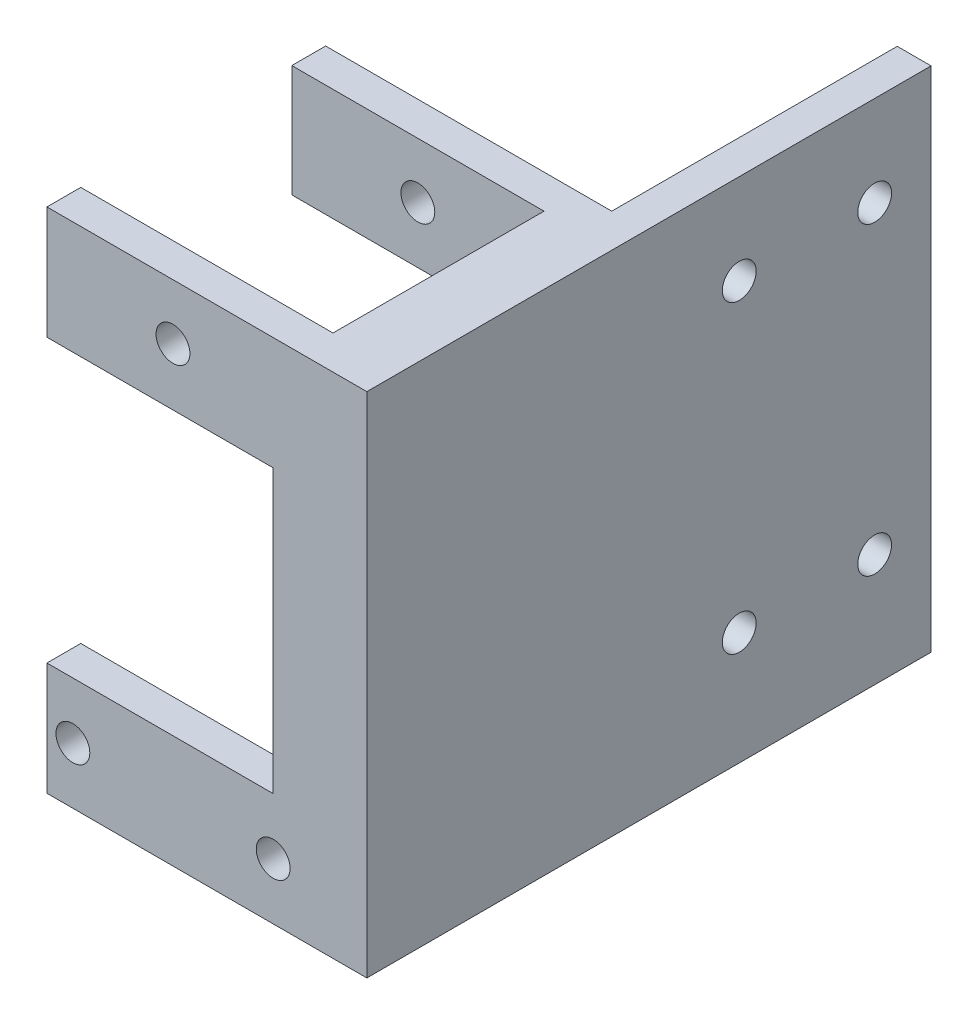
ISO-10303-21;
HEADER;
FILE_DESCRIPTION(('STEP AP214'),'2;1');
FILE_NAME('part.step','',(''),(''),'','','');
FILE_SCHEMA(('AUTOMOTIVE_DESIGN { 1 0 10303 214 1 1 1 1 }'));
ENDSEC;
DATA;
#1=APPLICATION_CONTEXT('core data for automotive mechanical design processes');
#2=APPLICATION_PROTOCOL_DEFINITION('international standard','automotive_design',2000,#1);
#3=PRODUCT_CONTEXT('',#1,'mechanical');
#4=PRODUCT('Part','Part','',(#3));
#5=PRODUCT_RELATED_PRODUCT_CATEGORY('part','',(#4));
#6=PRODUCT_DEFINITION_FORMATION('','',#4);
#7=PRODUCT_DEFINITION_CONTEXT('part definition',#1,'design');
#8=PRODUCT_DEFINITION('design','',#6,#7);
#9=PRODUCT_DEFINITION_SHAPE('','',#8);
#10=(LENGTH_UNIT() NAMED_UNIT(*) SI_UNIT(.MILLI.,.METRE.));
#11=(NAMED_UNIT(*) PLANE_ANGLE_UNIT() SI_UNIT($,.RADIAN.));
#12=(NAMED_UNIT(*) SI_UNIT($,.STERADIAN.) SOLID_ANGLE_UNIT());
#13=UNCERTAINTY_MEASURE_WITH_UNIT(LENGTH_MEASURE(1.E-05),#10,'distance_accuracy_value','');
#14=(GEOMETRIC_REPRESENTATION_CONTEXT(3) GLOBAL_UNCERTAINTY_ASSIGNED_CONTEXT((#13)) GLOBAL_UNIT_ASSIGNED_CONTEXT((#10,
#11,#12)) REPRESENTATION_CONTEXT('',''));
#15=CARTESIAN_POINT('',(0.,0.,0.));
#16=DIRECTION('',(0.,0.,1.));
#17=DIRECTION('',(1.,0.,0.));
#18=AXIS2_PLACEMENT_3D('',#15,#16,#17);
#19=CARTESIAN_POINT('',(0.,-22.5,-3.));
#20=DIRECTION('',(0.,1.,0.));
#21=DIRECTION('',(-1.,0.,0.));
#22=AXIS2_PLACEMENT_3D('',#19,#20,#21);
#23=PLANE('',#22);
#24=DIRECTION('',(0.,0.,1.));
#25=VECTOR('',#24,1.);
#26=CARTESIAN_POINT('',(9.675,-22.5,-21.7));
#27=LINE('',#26,#25);
#28=CARTESIAN_POINT('',(9.675,-22.5,-21.7));
#29=VERTEX_POINT('',#28);
#30=CARTESIAN_POINT('',(9.675,-22.5,-3.));
#31=VERTEX_POINT('',#30);
#32=EDGE_CURVE('E148',#29,#31,#27,.T.);
#33=ORIENTED_EDGE('',*,*,#32,.F.);
#34=DIRECTION('',(1.,0.,0.));
#35=VECTOR('',#34,1.);
#36=CARTESIAN_POINT('',(15.675,-22.5,-21.7));
#37=LINE('',#36,#35);
#38=CARTESIAN_POINT('',(-12.675,-22.5,-21.7));
#39=VERTEX_POINT('',#38);
#40=EDGE_CURVE('E260',#39,#29,#37,.T.);
#41=ORIENTED_EDGE('',*,*,#40,.F.);
#42=DIRECTION('',(0.,0.,1.));
#43=VECTOR('',#42,1.);
#44=CARTESIAN_POINT('',(-12.675,-22.5,-26.7));
#45=LINE('',#44,#43);
#46=CARTESIAN_POINT('',(-12.675,-22.5,-24.7));
#47=VERTEX_POINT('',#46);
#48=EDGE_CURVE('E478',#47,#39,#45,.T.);
#49=ORIENTED_EDGE('',*,*,#48,.F.);
#50=DIRECTION('',(-1.,0.,0.));
#51=VECTOR('',#50,1.);
#52=CARTESIAN_POINT('',(15.675,-22.5,-24.7));
#53=LINE('',#52,#51);
#54=CARTESIAN_POINT('',(12.675,-22.5,-24.7));
#55=VERTEX_POINT('',#54);
#56=EDGE_CURVE('E284',#55,#47,#53,.T.);
#57=ORIENTED_EDGE('',*,*,#56,.F.);
#58=DIRECTION('',(0.,0.,-1.));
#59=VECTOR('',#58,1.);
#60=CARTESIAN_POINT('',(12.675,-22.5,0.));
#61=LINE('',#60,#59);
#62=CARTESIAN_POINT('',(12.675,-22.5,-50.));
#63=VERTEX_POINT('',#62);
#64=EDGE_CURVE('E289',#55,#63,#61,.T.);
#65=ORIENTED_EDGE('',*,*,#64,.T.);
#66=DIRECTION('',(-1.,0.,0.));
#67=VECTOR('',#66,1.);
#68=CARTESIAN_POINT('',(15.675,-22.5,-50.));
#69=LINE('',#68,#67);
#70=CARTESIAN_POINT('',(15.675,-22.5,-50.));
#71=VERTEX_POINT('',#70);
#72=EDGE_CURVE('E329',#71,#63,#69,.T.);
#73=ORIENTED_EDGE('',*,*,#72,.F.);
#74=DIRECTION('',(0.,0.,-1.));
#75=VECTOR('',#74,1.);
#76=CARTESIAN_POINT('',(15.675,-22.5,0.));
#77=LINE('',#76,#75);
#78=CARTESIAN_POINT('',(15.675,-22.5,0.));
#79=VERTEX_POINT('',#78);
#80=EDGE_CURVE('E307',#79,#71,#77,.T.);
#81=ORIENTED_EDGE('',*,*,#80,.F.);
#82=DIRECTION('',(-1.,0.,0.));
#83=VECTOR('',#82,1.);
#84=CARTESIAN_POINT('',(0.,-22.5,0.));
#85=LINE('',#84,#83);
#86=CARTESIAN_POINT('',(-12.675,-22.5,0.));
#87=VERTEX_POINT('',#86);
#88=EDGE_CURVE('E393',#79,#87,#85,.T.);
#89=ORIENTED_EDGE('',*,*,#88,.T.);
#90=DIRECTION('',(0.,0.,1.));
#91=VECTOR('',#90,1.);
#92=CARTESIAN_POINT('',(-12.675,-22.5,-3.));
#93=LINE('',#92,#91);
#94=CARTESIAN_POINT('',(-12.675,-22.5,-3.));
#95=VERTEX_POINT('',#94);
#96=EDGE_CURVE('E407',#95,#87,#93,.T.);
#97=ORIENTED_EDGE('',*,*,#96,.F.);
#98=DIRECTION('',(-1.,0.,0.));
#99=VECTOR('',#98,1.);
#100=CARTESIAN_POINT('',(0.,-22.5,-3.));
#101=LINE('',#100,#99);
#102=EDGE_CURVE('E262',#31,#95,#101,.T.);
#103=ORIENTED_EDGE('',*,*,#102,.F.);
#104=EDGE_LOOP('',(#33,#41,#49,#57,#65,#73,#81,#89,#97,#103));
#105=FACE_BOUND('',#104,.T.);
#106=ADVANCED_FACE('F130',(#105),#23,.F.);
#107=CARTESIAN_POINT('',(0.,22.5,-3.));
#108=DIRECTION('',(0.,1.,0.));
#109=DIRECTION('',(-1.,0.,0.));
#110=AXIS2_PLACEMENT_3D('',#107,#108,#109);
#111=PLANE('',#110);
#112=DIRECTION('',(-1.,0.,0.));
#113=VECTOR('',#112,1.);
#114=CARTESIAN_POINT('',(15.675,22.5,-24.7));
#115=LINE('',#114,#113);
#116=CARTESIAN_POINT('',(12.675,22.5,-24.7));
#117=VERTEX_POINT('',#116);
#118=CARTESIAN_POINT('',(-12.675,22.5,-24.7));
#119=VERTEX_POINT('',#118);
#120=EDGE_CURVE('E296',#117,#119,#115,.T.);
#121=ORIENTED_EDGE('',*,*,#120,.T.);
#122=DIRECTION('',(0.,0.,1.));
#123=VECTOR('',#122,1.);
#124=CARTESIAN_POINT('',(-12.675,22.5,-26.7));
#125=LINE('',#124,#123);
#126=CARTESIAN_POINT('',(-12.675,22.5,-21.7));
#127=VERTEX_POINT('',#126);
#128=EDGE_CURVE('E481',#119,#127,#125,.T.);
#129=ORIENTED_EDGE('',*,*,#128,.T.);
#130=DIRECTION('',(1.,0.,0.));
#131=VECTOR('',#130,1.);
#132=CARTESIAN_POINT('',(15.675,22.5,-21.7));
#133=LINE('',#132,#131);
#134=CARTESIAN_POINT('',(9.675,22.5,-21.7));
#135=VERTEX_POINT('',#134);
#136=EDGE_CURVE('E292',#127,#135,#133,.T.);
#137=ORIENTED_EDGE('',*,*,#136,.T.);
#138=DIRECTION('',(0.,0.,-1.));
#139=VECTOR('',#138,1.);
#140=CARTESIAN_POINT('',(9.675,22.5,-21.7));
#141=LINE('',#140,#139);
#142=CARTESIAN_POINT('',(9.675,22.5,-3.));
#143=VERTEX_POINT('',#142);
#144=EDGE_CURVE('E270',#143,#135,#141,.T.);
#145=ORIENTED_EDGE('',*,*,#144,.F.);
#146=DIRECTION('',(-1.,0.,0.));
#147=VECTOR('',#146,1.);
#148=CARTESIAN_POINT('',(0.,22.5,-3.));
#149=LINE('',#148,#147);
#150=CARTESIAN_POINT('',(-12.675,22.5,-3.));
#151=VERTEX_POINT('',#150);
#152=EDGE_CURVE('E334',#143,#151,#149,.T.);
#153=ORIENTED_EDGE('',*,*,#152,.T.);
#154=DIRECTION('',(0.,0.,1.));
#155=VECTOR('',#154,1.);
#156=CARTESIAN_POINT('',(-12.675,22.5,-3.));
#157=LINE('',#156,#155);
#158=CARTESIAN_POINT('',(-12.675,22.5,0.));
#159=VERTEX_POINT('',#158);
#160=EDGE_CURVE('E370',#151,#159,#157,.T.);
#161=ORIENTED_EDGE('',*,*,#160,.T.);
#162=DIRECTION('',(-1.,0.,0.));
#163=VECTOR('',#162,1.);
#164=CARTESIAN_POINT('',(0.,22.5,0.));
#165=LINE('',#164,#163);
#166=CARTESIAN_POINT('',(15.675,22.5,0.));
#167=VERTEX_POINT('',#166);
#168=EDGE_CURVE('E333',#167,#159,#165,.T.);
#169=ORIENTED_EDGE('',*,*,#168,.F.);
#170=DIRECTION('',(0.,0.,1.));
#171=VECTOR('',#170,1.);
#172=CARTESIAN_POINT('',(15.675,22.5,0.));
#173=LINE('',#172,#171);
#174=CARTESIAN_POINT('',(15.675,22.5,-50.));
#175=VERTEX_POINT('',#174);
#176=EDGE_CURVE('E314',#175,#167,#173,.T.);
#177=ORIENTED_EDGE('',*,*,#176,.F.);
#178=DIRECTION('',(-1.,0.,0.));
#179=VECTOR('',#178,1.);
#180=CARTESIAN_POINT('',(15.675,22.5,-50.));
#181=LINE('',#180,#179);
#182=CARTESIAN_POINT('',(12.675,22.5,-50.));
#183=VERTEX_POINT('',#182);
#184=EDGE_CURVE('E317',#175,#183,#181,.T.);
#185=ORIENTED_EDGE('',*,*,#184,.T.);
#186=DIRECTION('',(0.,0.,1.));
#187=VECTOR('',#186,1.);
#188=CARTESIAN_POINT('',(12.675,22.5,0.));
#189=LINE('',#188,#187);
#190=EDGE_CURVE('E308',#183,#117,#189,.T.);
#191=ORIENTED_EDGE('',*,*,#190,.T.);
#192=EDGE_LOOP('',(#121,#129,#137,#145,#153,#161,#169,#177,#185,#191));
#193=FACE_BOUND('',#192,.T.);
#194=ADVANCED_FACE('F132',(#193),#111,.T.);
#195=CARTESIAN_POINT('',(15.675,-22.5,-21.7));
#196=DIRECTION('',(0.,0.,1.));
#197=DIRECTION('',(1.,0.,0.));
#198=AXIS2_PLACEMENT_3D('',#195,#196,#197);
#199=PLANE('',#198);
#200=DIRECTION('',(0.,-1.,0.));
#201=VECTOR('',#200,1.);
#202=CARTESIAN_POINT('',(9.675,22.5,-21.7));
#203=LINE('',#202,#201);
#204=EDGE_CURVE('E265',#135,#29,#203,.T.);
#205=ORIENTED_EDGE('',*,*,#204,.F.);
#206=ORIENTED_EDGE('',*,*,#136,.F.);
#207=DIRECTION('',(0.,-1.,0.));
#208=VECTOR('',#207,1.);
#209=CARTESIAN_POINT('',(-12.675,0.,-21.7));
#210=LINE('',#209,#208);
#211=CARTESIAN_POINT('',(-12.675,12.5728024085996,-21.7));
#212=VERTEX_POINT('',#211);
#213=EDGE_CURVE('E469',#127,#212,#210,.T.);
#214=ORIENTED_EDGE('',*,*,#213,.T.);
#215=DIRECTION('',(1.,0.,0.));
#216=VECTOR('',#215,1.);
#217=CARTESIAN_POINT('',(0.,12.5728024085996,-21.7));
#218=LINE('',#217,#216);
#219=CARTESIAN_POINT('',(7.37500000000001,12.5728024085996,-21.7));
#220=VERTEX_POINT('',#219);
#221=EDGE_CURVE('E461',#212,#220,#218,.T.);
#222=ORIENTED_EDGE('',*,*,#221,.T.);
#223=DIRECTION('',(0.,1.,0.));
#224=VECTOR('',#223,1.);
#225=CARTESIAN_POINT('',(7.37500000000001,0.,-21.7));
#226=LINE('',#225,#224);
#227=CARTESIAN_POINT('',(7.37500000000001,-12.5,-21.7));
#228=VERTEX_POINT('',#227);
#229=EDGE_CURVE('E455',#228,#220,#226,.T.);
#230=ORIENTED_EDGE('',*,*,#229,.F.);
#231=DIRECTION('',(1.,0.,0.));
#232=VECTOR('',#231,1.);
#233=CARTESIAN_POINT('',(0.,-12.5,-21.7));
#234=LINE('',#233,#232);
#235=CARTESIAN_POINT('',(-12.675,-12.5,-21.7));
#236=VERTEX_POINT('',#235);
#237=EDGE_CURVE('E450',#236,#228,#234,.T.);
#238=ORIENTED_EDGE('',*,*,#237,.F.);
#239=DIRECTION('',(0.,-1.,0.));
#240=VECTOR('',#239,1.);
#241=CARTESIAN_POINT('',(-12.675,0.,-21.7));
#242=LINE('',#241,#240);
#243=EDGE_CURVE('E281',#236,#39,#242,.T.);
#244=ORIENTED_EDGE('',*,*,#243,.T.);
#245=ORIENTED_EDGE('',*,*,#40,.T.);
#246=EDGE_LOOP('',(#205,#206,#214,#222,#230,#238,#244,#245));
#247=FACE_BOUND('',#246,.T.);
#248=CARTESIAN_POINT('',(7.375,-17.5,-21.7));
#249=DIRECTION('',(0.,0.,1.));
#250=DIRECTION('',(1.,0.,0.));
#251=AXIS2_PLACEMENT_3D('',#248,#249,#250);
#252=CIRCLE('',#251,1.5);
#253=CARTESIAN_POINT('',(8.875,-17.5,-21.7));
#254=VERTEX_POINT('',#253);
#255=EDGE_CURVE('E575',#254,#254,#252,.T.);
#256=ORIENTED_EDGE('',*,*,#255,.F.);
#257=EDGE_LOOP('',(#256));
#258=FACE_BOUND('',#257,.T.);
#259=CARTESIAN_POINT('',(-10.375,-17.5,-21.7));
#260=DIRECTION('',(0.,0.,1.));
#261=DIRECTION('',(1.,0.,0.));
#262=AXIS2_PLACEMENT_3D('',#259,#260,#261);
#263=CIRCLE('',#262,1.5);
#264=CARTESIAN_POINT('',(-8.875,-17.5,-21.7));
#265=VERTEX_POINT('',#264);
#266=EDGE_CURVE('E574',#265,#265,#263,.T.);
#267=ORIENTED_EDGE('',*,*,#266,.F.);
#268=EDGE_LOOP('',(#267));
#269=FACE_BOUND('',#268,.T.);
#270=CARTESIAN_POINT('',(-1.50500000000001,17.58,-21.7));
#271=DIRECTION('',(0.,0.,1.));
#272=DIRECTION('',(1.,0.,0.));
#273=AXIS2_PLACEMENT_3D('',#270,#271,#272);
#274=CIRCLE('',#273,1.5);
#275=CARTESIAN_POINT('',(-0.00500000000000327,17.58,-21.7));
#276=VERTEX_POINT('',#275);
#277=EDGE_CURVE('E443',#276,#276,#274,.T.);
#278=ORIENTED_EDGE('',*,*,#277,.F.);
#279=EDGE_LOOP('',(#278));
#280=FACE_BOUND('',#279,.T.);
#281=ADVANCED_FACE('F277',(#247,#258,#269,#280),#199,.T.);
#282=CARTESIAN_POINT('',(15.675,-22.5,-24.7));
#283=DIRECTION('',(0.,0.,-1.));
#284=DIRECTION('',(-1.,0.,0.));
#285=AXIS2_PLACEMENT_3D('',#282,#283,#284);
#286=PLANE('',#285);
#287=CARTESIAN_POINT('',(7.375,-17.5,-24.7));
#288=DIRECTION('',(0.,0.,-1.));
#289=DIRECTION('',(-1.,0.,0.));
#290=AXIS2_PLACEMENT_3D('',#287,#288,#289);
#291=CIRCLE('',#290,1.5);
#292=CARTESIAN_POINT('',(5.875,-17.5,-24.7));
#293=VERTEX_POINT('',#292);
#294=EDGE_CURVE('E134',#293,#293,#291,.T.);
#295=ORIENTED_EDGE('',*,*,#294,.F.);
#296=EDGE_LOOP('',(#295));
#297=FACE_BOUND('',#296,.T.);
#298=CARTESIAN_POINT('',(-10.375,-17.5,-24.7));
#299=DIRECTION('',(0.,0.,-1.));
#300=DIRECTION('',(-1.,0.,0.));
#301=AXIS2_PLACEMENT_3D('',#298,#299,#300);
#302=CIRCLE('',#301,1.5);
#303=CARTESIAN_POINT('',(-11.875,-17.5,-24.7));
#304=VERTEX_POINT('',#303);
#305=EDGE_CURVE('E442',#304,#304,#302,.T.);
#306=ORIENTED_EDGE('',*,*,#305,.F.);
#307=EDGE_LOOP('',(#306));
#308=FACE_BOUND('',#307,.T.);
#309=CARTESIAN_POINT('',(-1.50500000000001,17.58,-24.7));
#310=DIRECTION('',(0.,0.,-1.));
#311=DIRECTION('',(-1.,0.,0.));
#312=AXIS2_PLACEMENT_3D('',#309,#310,#311);
#313=CIRCLE('',#312,1.5);
#314=CARTESIAN_POINT('',(-3.00500000000001,17.58,-24.7));
#315=VERTEX_POINT('',#314);
#316=EDGE_CURVE('E439',#315,#315,#313,.T.);
#317=ORIENTED_EDGE('',*,*,#316,.F.);
#318=EDGE_LOOP('',(#317));
#319=FACE_BOUND('',#318,.T.);
#320=ORIENTED_EDGE('',*,*,#56,.T.);
#321=DIRECTION('',(0.,1.,0.));
#322=VECTOR('',#321,1.);
#323=CARTESIAN_POINT('',(-12.675,-22.5,-24.7));
#324=LINE('',#323,#322);
#325=CARTESIAN_POINT('',(-12.675,-12.5,-24.7));
#326=VERTEX_POINT('',#325);
#327=EDGE_CURVE('E12',#47,#326,#324,.T.);
#328=ORIENTED_EDGE('',*,*,#327,.T.);
#329=DIRECTION('',(-1.,0.,0.));
#330=VECTOR('',#329,1.);
#331=CARTESIAN_POINT('',(15.675,-12.5,-24.7));
#332=LINE('',#331,#330);
#333=CARTESIAN_POINT('',(7.37500000000001,-12.5,-24.7));
#334=VERTEX_POINT('',#333);
#335=EDGE_CURVE('E140',#334,#326,#332,.T.);
#336=ORIENTED_EDGE('',*,*,#335,.F.);
#337=DIRECTION('',(0.,-1.,0.));
#338=VECTOR('',#337,1.);
#339=CARTESIAN_POINT('',(7.37500000000001,-22.5,-24.7));
#340=LINE('',#339,#338);
#341=CARTESIAN_POINT('',(7.37500000000001,12.5728024085996,-24.7));
#342=VERTEX_POINT('',#341);
#343=EDGE_CURVE('E411',#342,#334,#340,.T.);
#344=ORIENTED_EDGE('',*,*,#343,.F.);
#345=DIRECTION('',(-1.,0.,0.));
#346=VECTOR('',#345,1.);
#347=CARTESIAN_POINT('',(15.675,12.5728024085996,-24.7));
#348=LINE('',#347,#346);
#349=CARTESIAN_POINT('',(-12.675,12.5728024085996,-24.7));
#350=VERTEX_POINT('',#349);
#351=EDGE_CURVE('E429',#342,#350,#348,.T.);
#352=ORIENTED_EDGE('',*,*,#351,.T.);
#353=DIRECTION('',(0.,1.,0.));
#354=VECTOR('',#353,1.);
#355=CARTESIAN_POINT('',(-12.675,-22.5,-24.7));
#356=LINE('',#355,#354);
#357=EDGE_CURVE('E433',#350,#119,#356,.T.);
#358=ORIENTED_EDGE('',*,*,#357,.T.);
#359=ORIENTED_EDGE('',*,*,#120,.F.);
#360=DIRECTION('',(0.,1.,0.));
#361=VECTOR('',#360,1.);
#362=CARTESIAN_POINT('',(12.675,0.,-24.7));
#363=LINE('',#362,#361);
#364=EDGE_CURVE('E283',#55,#117,#363,.T.);
#365=ORIENTED_EDGE('',*,*,#364,.F.);
#366=EDGE_LOOP('',(#320,#328,#336,#344,#352,#358,#359,#365));
#367=FACE_BOUND('',#366,.T.);
#368=ADVANCED_FACE('F496',(#297,#308,#319,#367),#286,.T.);
#369=CARTESIAN_POINT('',(-12.675,0.,-3.));
#370=DIRECTION('',(1.,0.,0.));
#371=DIRECTION('',(0.,0.,-1.));
#372=AXIS2_PLACEMENT_3D('',#369,#370,#371);
#373=PLANE('',#372);
#374=DIRECTION('',(0.,1.,0.));
#375=VECTOR('',#374,1.);
#376=CARTESIAN_POINT('',(-12.675,0.,0.));
#377=LINE('',#376,#375);
#378=CARTESIAN_POINT('',(-12.675,-12.5,0.));
#379=VERTEX_POINT('',#378);
#380=EDGE_CURVE('E390',#87,#379,#377,.T.);
#381=ORIENTED_EDGE('',*,*,#380,.T.);
#382=DIRECTION('',(0.,0.,1.));
#383=VECTOR('',#382,1.);
#384=CARTESIAN_POINT('',(-12.675,-12.5,-3.));
#385=LINE('',#384,#383);
#386=CARTESIAN_POINT('',(-12.675,-12.5,-3.));
#387=VERTEX_POINT('',#386);
#388=EDGE_CURVE('E412',#387,#379,#385,.T.);
#389=ORIENTED_EDGE('',*,*,#388,.F.);
#390=DIRECTION('',(0.,1.,0.));
#391=VECTOR('',#390,1.);
#392=CARTESIAN_POINT('',(-12.675,0.,-3.));
#393=LINE('',#392,#391);
#394=EDGE_CURVE('E353',#95,#387,#393,.T.);
#395=ORIENTED_EDGE('',*,*,#394,.F.);
#396=ORIENTED_EDGE('',*,*,#96,.T.);
#397=EDGE_LOOP('',(#381,#389,#395,#396));
#398=FACE_BOUND('',#397,.T.);
#399=ADVANCED_FACE('F521',(#398),#373,.F.);
#400=CARTESIAN_POINT('',(0.,-12.5,-3.));
#401=DIRECTION('',(0.,-1.,0.));
#402=DIRECTION('',(0.,0.,-1.));
#403=AXIS2_PLACEMENT_3D('',#400,#401,#402);
#404=PLANE('',#403);
#405=DIRECTION('',(1.,0.,0.));
#406=VECTOR('',#405,1.);
#407=CARTESIAN_POINT('',(0.,-12.5,0.));
#408=LINE('',#407,#406);
#409=CARTESIAN_POINT('',(7.37500000000001,-12.5,0.));
#410=VERTEX_POINT('',#409);
#411=EDGE_CURVE('E386',#379,#410,#408,.T.);
#412=ORIENTED_EDGE('',*,*,#411,.T.);
#413=DIRECTION('',(0.,0.,1.));
#414=VECTOR('',#413,1.);
#415=CARTESIAN_POINT('',(7.37500000000001,-12.5,-3.));
#416=LINE('',#415,#414);
#417=CARTESIAN_POINT('',(7.37500000000001,-12.5,-3.));
#418=VERTEX_POINT('',#417);
#419=EDGE_CURVE('E416',#418,#410,#416,.T.);
#420=ORIENTED_EDGE('',*,*,#419,.F.);
#421=DIRECTION('',(1.,0.,0.));
#422=VECTOR('',#421,1.);
#423=CARTESIAN_POINT('',(0.,-12.5,-3.));
#424=LINE('',#423,#422);
#425=EDGE_CURVE('E350',#387,#418,#424,.T.);
#426=ORIENTED_EDGE('',*,*,#425,.F.);
#427=ORIENTED_EDGE('',*,*,#388,.T.);
#428=EDGE_LOOP('',(#412,#420,#426,#427));
#429=FACE_BOUND('',#428,.T.);
#430=ADVANCED_FACE('F529',(#429),#404,.F.);
#431=CARTESIAN_POINT('',(7.375,0.,-3.));
#432=DIRECTION('',(-1.,0.,0.));
#433=DIRECTION('',(0.,-1.,0.));
#434=AXIS2_PLACEMENT_3D('',#431,#432,#433);
#435=PLANE('',#434);
#436=DIRECTION('',(0.,-1.,0.));
#437=VECTOR('',#436,1.);
#438=CARTESIAN_POINT('',(7.375,0.,0.));
#439=LINE('',#438,#437);
#440=CARTESIAN_POINT('',(7.375,12.5,0.));
#441=VERTEX_POINT('',#440);
#442=EDGE_CURVE('E382',#441,#410,#439,.T.);
#443=ORIENTED_EDGE('',*,*,#442,.F.);
#444=DIRECTION('',(0.,0.,1.));
#445=VECTOR('',#444,1.);
#446=CARTESIAN_POINT('',(7.375,12.5,-3.));
#447=LINE('',#446,#445);
#448=CARTESIAN_POINT('',(7.375,12.5,-3.));
#449=VERTEX_POINT('',#448);
#450=EDGE_CURVE('E419',#449,#441,#447,.T.);
#451=ORIENTED_EDGE('',*,*,#450,.F.);
#452=DIRECTION('',(0.,-1.,0.));
#453=VECTOR('',#452,1.);
#454=CARTESIAN_POINT('',(7.375,0.,-3.));
#455=LINE('',#454,#453);
#456=EDGE_CURVE('E346',#449,#418,#455,.T.);
#457=ORIENTED_EDGE('',*,*,#456,.T.);
#458=ORIENTED_EDGE('',*,*,#419,.T.);
#459=EDGE_LOOP('',(#443,#451,#457,#458));
#460=FACE_BOUND('',#459,.T.);
#461=ADVANCED_FACE('F619',(#460),#435,.T.);
#462=CARTESIAN_POINT('',(0.,12.5,-3.));
#463=DIRECTION('',(0.,-1.,0.));
#464=DIRECTION('',(0.,0.,-1.));
#465=AXIS2_PLACEMENT_3D('',#462,#463,#464);
#466=PLANE('',#465);
#467=DIRECTION('',(1.,0.,0.));
#468=VECTOR('',#467,1.);
#469=CARTESIAN_POINT('',(0.,12.5,0.));
#470=LINE('',#469,#468);
#471=CARTESIAN_POINT('',(-12.675,12.5,0.));
#472=VERTEX_POINT('',#471);
#473=EDGE_CURVE('E378',#472,#441,#470,.T.);
#474=ORIENTED_EDGE('',*,*,#473,.F.);
#475=DIRECTION('',(0.,0.,1.));
#476=VECTOR('',#475,1.);
#477=CARTESIAN_POINT('',(-12.675,12.5,-3.));
#478=LINE('',#477,#476);
#479=CARTESIAN_POINT('',(-12.675,12.5,-3.));
#480=VERTEX_POINT('',#479);
#481=EDGE_CURVE('E422',#480,#472,#478,.T.);
#482=ORIENTED_EDGE('',*,*,#481,.F.);
#483=DIRECTION('',(1.,0.,0.));
#484=VECTOR('',#483,1.);
#485=CARTESIAN_POINT('',(0.,12.5,-3.));
#486=LINE('',#485,#484);
#487=EDGE_CURVE('E342',#480,#449,#486,.T.);
#488=ORIENTED_EDGE('',*,*,#487,.T.);
#489=ORIENTED_EDGE('',*,*,#450,.T.);
#490=EDGE_LOOP('',(#474,#482,#488,#489));
#491=FACE_BOUND('',#490,.T.);
#492=ADVANCED_FACE('F622',(#491),#466,.T.);
#493=CARTESIAN_POINT('',(-12.675,0.,-3.));
#494=DIRECTION('',(1.,0.,0.));
#495=DIRECTION('',(0.,0.,-1.));
#496=AXIS2_PLACEMENT_3D('',#493,#494,#495);
#497=PLANE('',#496);
#498=DIRECTION('',(0.,1.,0.));
#499=VECTOR('',#498,1.);
#500=CARTESIAN_POINT('',(-12.675,0.,0.));
#501=LINE('',#500,#499);
#502=EDGE_CURVE('E374',#472,#159,#501,.T.);
#503=ORIENTED_EDGE('',*,*,#502,.T.);
#504=ORIENTED_EDGE('',*,*,#160,.F.);
#505=DIRECTION('',(0.,1.,0.));
#506=VECTOR('',#505,1.);
#507=CARTESIAN_POINT('',(-12.675,0.,-3.));
#508=LINE('',#507,#506);
#509=EDGE_CURVE('E337',#480,#151,#508,.T.);
#510=ORIENTED_EDGE('',*,*,#509,.F.);
#511=ORIENTED_EDGE('',*,*,#481,.T.);
#512=EDGE_LOOP('',(#503,#504,#510,#511));
#513=FACE_BOUND('',#512,.T.);
#514=ADVANCED_FACE('F625',(#513),#497,.F.);
#515=CARTESIAN_POINT('',(7.375,-17.5,-3.));
#516=DIRECTION('',(0.,0.,1.));
#517=DIRECTION('',(1.,0.,0.));
#518=AXIS2_PLACEMENT_3D('',#515,#516,#517);
#519=CYLINDRICAL_SURFACE('',#518,1.5);
#520=CARTESIAN_POINT('',(7.375,-17.5,-3.));
#521=DIRECTION('',(0.,0.,1.));
#522=DIRECTION('',(1.,0.,0.));
#523=AXIS2_PLACEMENT_3D('',#520,#521,#522);
#524=CIRCLE('',#523,1.5);
#525=CARTESIAN_POINT('',(8.875,-17.5,-3.));
#526=VERTEX_POINT('',#525);
#527=EDGE_CURVE('E362',#526,#526,#524,.T.);
#528=ORIENTED_EDGE('',*,*,#527,.F.);
#529=EDGE_LOOP('',(#528));
#530=FACE_BOUND('',#529,.T.);
#531=CARTESIAN_POINT('',(7.375,-17.5,0.));
#532=DIRECTION('',(0.,0.,1.));
#533=DIRECTION('',(1.,0.,0.));
#534=AXIS2_PLACEMENT_3D('',#531,#532,#533);
#535=CIRCLE('',#534,1.5);
#536=CARTESIAN_POINT('',(8.875,-17.5,0.));
#537=VERTEX_POINT('',#536);
#538=EDGE_CURVE('E400',#537,#537,#535,.T.);
#539=ORIENTED_EDGE('',*,*,#538,.T.);
#540=EDGE_LOOP('',(#539));
#541=FACE_BOUND('',#540,.T.);
#542=ADVANCED_FACE('F628',(#530,#541),#519,.F.);
#543=CARTESIAN_POINT('',(-10.375,-17.5,-3.));
#544=DIRECTION('',(0.,0.,1.));
#545=DIRECTION('',(1.,0.,0.));
#546=AXIS2_PLACEMENT_3D('',#543,#544,#545);
#547=CYLINDRICAL_SURFACE('',#546,1.5);
#548=CARTESIAN_POINT('',(-10.375,-17.5,-3.));
#549=DIRECTION('',(0.,0.,1.));
#550=DIRECTION('',(1.,0.,0.));
#551=AXIS2_PLACEMENT_3D('',#548,#549,#550);
#552=CIRCLE('',#551,1.5);
#553=CARTESIAN_POINT('',(-8.875,-17.5,-3.));
#554=VERTEX_POINT('',#553);
#555=EDGE_CURVE('E358',#554,#554,#552,.T.);
#556=ORIENTED_EDGE('',*,*,#555,.F.);
#557=EDGE_LOOP('',(#556));
#558=FACE_BOUND('',#557,.T.);
#559=CARTESIAN_POINT('',(-10.375,-17.5,0.));
#560=DIRECTION('',(0.,0.,1.));
#561=DIRECTION('',(1.,0.,0.));
#562=AXIS2_PLACEMENT_3D('',#559,#560,#561);
#563=CIRCLE('',#562,1.5);
#564=CARTESIAN_POINT('',(-8.875,-17.5,0.));
#565=VERTEX_POINT('',#564);
#566=EDGE_CURVE('E396',#565,#565,#563,.T.);
#567=ORIENTED_EDGE('',*,*,#566,.T.);
#568=EDGE_LOOP('',(#567));
#569=FACE_BOUND('',#568,.T.);
#570=ADVANCED_FACE('F613',(#558,#569),#547,.F.);
#571=CARTESIAN_POINT('',(-1.50500000000001,17.58,-3.));
#572=DIRECTION('',(0.,0.,1.));
#573=DIRECTION('',(1.,0.,0.));
#574=AXIS2_PLACEMENT_3D('',#571,#572,#573);
#575=CYLINDRICAL_SURFACE('',#574,1.5);
#576=CARTESIAN_POINT('',(-1.50500000000001,17.58,-3.));
#577=DIRECTION('',(0.,0.,1.));
#578=DIRECTION('',(1.,0.,0.));
#579=AXIS2_PLACEMENT_3D('',#576,#577,#578);
#580=CIRCLE('',#579,1.5);
#581=CARTESIAN_POINT('',(-0.00500000000000327,17.58,-3.));
#582=VERTEX_POINT('',#581);
#583=EDGE_CURVE('E366',#582,#582,#580,.T.);
#584=ORIENTED_EDGE('',*,*,#583,.F.);
#585=EDGE_LOOP('',(#584));
#586=FACE_BOUND('',#585,.T.);
#587=CARTESIAN_POINT('',(-1.50500000000001,17.58,0.));
#588=DIRECTION('',(0.,0.,1.));
#589=DIRECTION('',(1.,0.,0.));
#590=AXIS2_PLACEMENT_3D('',#587,#588,#589);
#591=CIRCLE('',#590,1.5);
#592=CARTESIAN_POINT('',(-0.00500000000000327,17.58,0.));
#593=VERTEX_POINT('',#592);
#594=EDGE_CURVE('E338',#593,#593,#591,.T.);
#595=ORIENTED_EDGE('',*,*,#594,.T.);
#596=EDGE_LOOP('',(#595));
#597=FACE_BOUND('',#596,.T.);
#598=ADVANCED_FACE('F664',(#586,#597),#575,.F.);
#599=CARTESIAN_POINT('',(0.,0.,-3.));
#600=DIRECTION('',(0.,0.,1.));
#601=DIRECTION('',(1.,0.,0.));
#602=AXIS2_PLACEMENT_3D('',#599,#600,#601);
#603=PLANE('',#602);
#604=ORIENTED_EDGE('',*,*,#152,.F.);
#605=DIRECTION('',(0.,1.,0.));
#606=VECTOR('',#605,1.);
#607=CARTESIAN_POINT('',(9.675,22.5,-3.));
#608=LINE('',#607,#606);
#609=EDGE_CURVE('E264',#31,#143,#608,.T.);
#610=ORIENTED_EDGE('',*,*,#609,.F.);
#611=ORIENTED_EDGE('',*,*,#102,.T.);
#612=ORIENTED_EDGE('',*,*,#394,.T.);
#613=ORIENTED_EDGE('',*,*,#425,.T.);
#614=ORIENTED_EDGE('',*,*,#456,.F.);
#615=ORIENTED_EDGE('',*,*,#487,.F.);
#616=ORIENTED_EDGE('',*,*,#509,.T.);
#617=EDGE_LOOP('',(#604,#610,#611,#612,#613,#614,#615,#616));
#618=FACE_BOUND('',#617,.T.);
#619=ORIENTED_EDGE('',*,*,#555,.T.);
#620=EDGE_LOOP('',(#619));
#621=FACE_BOUND('',#620,.T.);
#622=ORIENTED_EDGE('',*,*,#527,.T.);
#623=EDGE_LOOP('',(#622));
#624=FACE_BOUND('',#623,.T.);
#625=ORIENTED_EDGE('',*,*,#583,.T.);
#626=EDGE_LOOP('',(#625));
#627=FACE_BOUND('',#626,.T.);
#628=ADVANCED_FACE('F534',(#618,#621,#624,#627),#603,.F.);
#629=CARTESIAN_POINT('',(0.,0.,0.));
#630=DIRECTION('',(0.,0.,1.));
#631=DIRECTION('',(1.,0.,0.));
#632=AXIS2_PLACEMENT_3D('',#629,#630,#631);
#633=PLANE('',#632);
#634=ORIENTED_EDGE('',*,*,#88,.F.);
#635=DIRECTION('',(0.,-1.,0.));
#636=VECTOR('',#635,1.);
#637=CARTESIAN_POINT('',(15.675,22.5,0.));
#638=LINE('',#637,#636);
#639=EDGE_CURVE('E303',#167,#79,#638,.T.);
#640=ORIENTED_EDGE('',*,*,#639,.F.);
#641=ORIENTED_EDGE('',*,*,#168,.T.);
#642=ORIENTED_EDGE('',*,*,#502,.F.);
#643=ORIENTED_EDGE('',*,*,#473,.T.);
#644=ORIENTED_EDGE('',*,*,#442,.T.);
#645=ORIENTED_EDGE('',*,*,#411,.F.);
#646=ORIENTED_EDGE('',*,*,#380,.F.);
#647=EDGE_LOOP('',(#634,#640,#641,#642,#643,#644,#645,#646));
#648=FACE_BOUND('',#647,.T.);
#649=ORIENTED_EDGE('',*,*,#566,.F.);
#650=EDGE_LOOP('',(#649));
#651=FACE_BOUND('',#650,.T.);
#652=ORIENTED_EDGE('',*,*,#538,.F.);
#653=EDGE_LOOP('',(#652));
#654=FACE_BOUND('',#653,.T.);
#655=ORIENTED_EDGE('',*,*,#594,.F.);
#656=EDGE_LOOP('',(#655));
#657=FACE_BOUND('',#656,.T.);
#658=ADVANCED_FACE('F524',(#648,#651,#654,#657),#633,.T.);
#659=CARTESIAN_POINT('',(12.675,0.,0.));
#660=DIRECTION('',(1.,0.,0.));
#661=DIRECTION('',(0.,0.,-1.));
#662=AXIS2_PLACEMENT_3D('',#659,#660,#661);
#663=PLANE('',#662);
#664=CARTESIAN_POINT('',(12.675,14.5,-33.));
#665=DIRECTION('',(1.,0.,0.));
#666=DIRECTION('',(0.,0.,-1.));
#667=AXIS2_PLACEMENT_3D('',#664,#665,#666);
#668=CIRCLE('',#667,1.5);
#669=CARTESIAN_POINT('',(12.675,14.5,-34.5));
#670=VERTEX_POINT('',#669);
#671=EDGE_CURVE('E570',#670,#670,#668,.T.);
#672=ORIENTED_EDGE('',*,*,#671,.T.);
#673=EDGE_LOOP('',(#672));
#674=FACE_BOUND('',#673,.T.);
#675=CARTESIAN_POINT('',(12.675,14.5,-45.));
#676=DIRECTION('',(1.,0.,0.));
#677=DIRECTION('',(0.,0.,-1.));
#678=AXIS2_PLACEMENT_3D('',#675,#676,#677);
#679=CIRCLE('',#678,1.5);
#680=CARTESIAN_POINT('',(12.675,14.5,-46.5));
#681=VERTEX_POINT('',#680);
#682=EDGE_CURVE('E566',#681,#681,#679,.T.);
#683=ORIENTED_EDGE('',*,*,#682,.T.);
#684=EDGE_LOOP('',(#683));
#685=FACE_BOUND('',#684,.T.);
#686=CARTESIAN_POINT('',(12.675,-12.5,-45.));
#687=DIRECTION('',(1.,0.,0.));
#688=DIRECTION('',(0.,0.,-1.));
#689=AXIS2_PLACEMENT_3D('',#686,#687,#688);
#690=CIRCLE('',#689,1.5);
#691=CARTESIAN_POINT('',(12.675,-12.5,-46.5));
#692=VERTEX_POINT('',#691);
#693=EDGE_CURVE('E562',#692,#692,#690,.T.);
#694=ORIENTED_EDGE('',*,*,#693,.T.);
#695=EDGE_LOOP('',(#694));
#696=FACE_BOUND('',#695,.T.);
#697=CARTESIAN_POINT('',(12.675,-12.5,-33.));
#698=DIRECTION('',(1.,0.,0.));
#699=DIRECTION('',(0.,0.,-1.));
#700=AXIS2_PLACEMENT_3D('',#697,#698,#699);
#701=CIRCLE('',#700,1.5);
#702=CARTESIAN_POINT('',(12.675,-12.5,-34.5));
#703=VERTEX_POINT('',#702);
#704=EDGE_CURVE('E558',#703,#703,#701,.T.);
#705=ORIENTED_EDGE('',*,*,#704,.T.);
#706=EDGE_LOOP('',(#705));
#707=FACE_BOUND('',#706,.T.);
#708=ORIENTED_EDGE('',*,*,#64,.F.);
#709=ORIENTED_EDGE('',*,*,#364,.T.);
#710=ORIENTED_EDGE('',*,*,#190,.F.);
#711=DIRECTION('',(0.,1.,0.));
#712=VECTOR('',#711,1.);
#713=CARTESIAN_POINT('',(12.675,22.5,-50.));
#714=LINE('',#713,#712);
#715=EDGE_CURVE('E320',#63,#183,#714,.T.);
#716=ORIENTED_EDGE('',*,*,#715,.F.);
#717=EDGE_LOOP('',(#708,#709,#710,#716));
#718=FACE_BOUND('',#717,.T.);
#719=ADVANCED_FACE('F504',(#674,#685,#696,#707,#718),#663,.F.);
#720=CARTESIAN_POINT('',(15.675,22.5,-50.));
#721=DIRECTION('',(0.,0.,1.));
#722=DIRECTION('',(1.,0.,0.));
#723=AXIS2_PLACEMENT_3D('',#720,#721,#722);
#724=PLANE('',#723);
#725=ORIENTED_EDGE('',*,*,#715,.T.);
#726=ORIENTED_EDGE('',*,*,#184,.F.);
#727=DIRECTION('',(0.,1.,0.));
#728=VECTOR('',#727,1.);
#729=CARTESIAN_POINT('',(15.675,22.5,-50.));
#730=LINE('',#729,#728);
#731=EDGE_CURVE('E311',#71,#175,#730,.T.);
#732=ORIENTED_EDGE('',*,*,#731,.F.);
#733=ORIENTED_EDGE('',*,*,#72,.T.);
#734=EDGE_LOOP('',(#725,#726,#732,#733));
#735=FACE_BOUND('',#734,.T.);
#736=ADVANCED_FACE('F508',(#735),#724,.F.);
#737=CARTESIAN_POINT('',(15.675,0.,0.));
#738=DIRECTION('',(1.,0.,0.));
#739=DIRECTION('',(0.,0.,-1.));
#740=AXIS2_PLACEMENT_3D('',#737,#738,#739);
#741=PLANE('',#740);
#742=CARTESIAN_POINT('',(15.675,14.5,-33.));
#743=DIRECTION('',(1.,0.,0.));
#744=DIRECTION('',(0.,0.,-1.));
#745=AXIS2_PLACEMENT_3D('',#742,#743,#744);
#746=CIRCLE('',#745,1.5);
#747=CARTESIAN_POINT('',(15.675,14.5,-34.5));
#748=VERTEX_POINT('',#747);
#749=EDGE_CURVE('E540',#748,#748,#746,.T.);
#750=ORIENTED_EDGE('',*,*,#749,.F.);
#751=EDGE_LOOP('',(#750));
#752=FACE_BOUND('',#751,.T.);
#753=CARTESIAN_POINT('',(15.675,14.5,-45.));
#754=DIRECTION('',(1.,0.,0.));
#755=DIRECTION('',(0.,0.,-1.));
#756=AXIS2_PLACEMENT_3D('',#753,#754,#755);
#757=CIRCLE('',#756,1.5);
#758=CARTESIAN_POINT('',(15.675,14.5,-46.5));
#759=VERTEX_POINT('',#758);
#760=EDGE_CURVE('E548',#759,#759,#757,.T.);
#761=ORIENTED_EDGE('',*,*,#760,.F.);
#762=EDGE_LOOP('',(#761));
#763=FACE_BOUND('',#762,.T.);
#764=CARTESIAN_POINT('',(15.675,-12.5,-45.));
#765=DIRECTION('',(1.,0.,0.));
#766=DIRECTION('',(0.,0.,-1.));
#767=AXIS2_PLACEMENT_3D('',#764,#765,#766);
#768=CIRCLE('',#767,1.5);
#769=CARTESIAN_POINT('',(15.675,-12.5,-46.5));
#770=VERTEX_POINT('',#769);
#771=EDGE_CURVE('E543',#770,#770,#768,.T.);
#772=ORIENTED_EDGE('',*,*,#771,.F.);
#773=EDGE_LOOP('',(#772));
#774=FACE_BOUND('',#773,.T.);
#775=CARTESIAN_POINT('',(15.675,-12.5,-33.));
#776=DIRECTION('',(1.,0.,0.));
#777=DIRECTION('',(0.,0.,-1.));
#778=AXIS2_PLACEMENT_3D('',#775,#776,#777);
#779=CIRCLE('',#778,1.5);
#780=CARTESIAN_POINT('',(15.675,-12.5,-34.5));
#781=VERTEX_POINT('',#780);
#782=EDGE_CURVE('E547',#781,#781,#779,.T.);
#783=ORIENTED_EDGE('',*,*,#782,.F.);
#784=EDGE_LOOP('',(#783));
#785=FACE_BOUND('',#784,.T.);
#786=ORIENTED_EDGE('',*,*,#176,.T.);
#787=ORIENTED_EDGE('',*,*,#639,.T.);
#788=ORIENTED_EDGE('',*,*,#80,.T.);
#789=ORIENTED_EDGE('',*,*,#731,.T.);
#790=EDGE_LOOP('',(#786,#787,#788,#789));
#791=FACE_BOUND('',#790,.T.);
#792=ADVANCED_FACE('F515',(#752,#763,#774,#785,#791),#741,.T.);
#793=CARTESIAN_POINT('',(0.,-12.5,-26.7));
#794=DIRECTION('',(0.,-1.,0.));
#795=DIRECTION('',(0.,0.,-1.));
#796=AXIS2_PLACEMENT_3D('',#793,#794,#795);
#797=PLANE('',#796);
#798=ORIENTED_EDGE('',*,*,#335,.T.);
#799=DIRECTION('',(0.,0.,1.));
#800=VECTOR('',#799,1.);
#801=CARTESIAN_POINT('',(-12.675,-12.5,-26.7));
#802=LINE('',#801,#800);
#803=EDGE_CURVE('E300',#326,#236,#802,.T.);
#804=ORIENTED_EDGE('',*,*,#803,.T.);
#805=ORIENTED_EDGE('',*,*,#237,.T.);
#806=DIRECTION('',(0.,0.,1.));
#807=VECTOR('',#806,1.);
#808=CARTESIAN_POINT('',(7.37500000000001,-12.5,-26.7));
#809=LINE('',#808,#807);
#810=EDGE_CURVE('E475',#334,#228,#809,.T.);
#811=ORIENTED_EDGE('',*,*,#810,.F.);
#812=EDGE_LOOP('',(#798,#804,#805,#811));
#813=FACE_BOUND('',#812,.T.);
#814=ADVANCED_FACE('F493',(#813),#797,.F.);
#815=CARTESIAN_POINT('',(-12.675,0.,-26.7));
#816=DIRECTION('',(-1.,0.,0.));
#817=DIRECTION('',(0.,-1.,0.));
#818=AXIS2_PLACEMENT_3D('',#815,#816,#817);
#819=PLANE('',#818);
#820=ORIENTED_EDGE('',*,*,#48,.T.);
#821=ORIENTED_EDGE('',*,*,#243,.F.);
#822=ORIENTED_EDGE('',*,*,#803,.F.);
#823=ORIENTED_EDGE('',*,*,#327,.F.);
#824=EDGE_LOOP('',(#820,#821,#822,#823));
#825=FACE_BOUND('',#824,.T.);
#826=ADVANCED_FACE('F499',(#825),#819,.T.);
#827=CARTESIAN_POINT('',(-12.675,0.,-26.7));
#828=DIRECTION('',(-1.,0.,0.));
#829=DIRECTION('',(0.,-1.,0.));
#830=AXIS2_PLACEMENT_3D('',#827,#828,#829);
#831=PLANE('',#830);
#832=DIRECTION('',(0.,0.,1.));
#833=VECTOR('',#832,1.);
#834=CARTESIAN_POINT('',(-12.675,12.5728024085996,-26.7));
#835=LINE('',#834,#833);
#836=EDGE_CURVE('E485',#350,#212,#835,.T.);
#837=ORIENTED_EDGE('',*,*,#836,.T.);
#838=ORIENTED_EDGE('',*,*,#213,.F.);
#839=ORIENTED_EDGE('',*,*,#128,.F.);
#840=ORIENTED_EDGE('',*,*,#357,.F.);
#841=EDGE_LOOP('',(#837,#838,#839,#840));
#842=FACE_BOUND('',#841,.T.);
#843=ADVANCED_FACE('F640',(#842),#831,.T.);
#844=CARTESIAN_POINT('',(0.,12.5728024085996,-26.7));
#845=DIRECTION('',(0.,-1.,0.));
#846=DIRECTION('',(0.,0.,-1.));
#847=AXIS2_PLACEMENT_3D('',#844,#845,#846);
#848=PLANE('',#847);
#849=DIRECTION('',(0.,0.,1.));
#850=VECTOR('',#849,1.);
#851=CARTESIAN_POINT('',(7.37500000000001,12.5728024085996,-26.7));
#852=LINE('',#851,#850);
#853=EDGE_CURVE('E156',#342,#220,#852,.T.);
#854=ORIENTED_EDGE('',*,*,#853,.T.);
#855=ORIENTED_EDGE('',*,*,#221,.F.);
#856=ORIENTED_EDGE('',*,*,#836,.F.);
#857=ORIENTED_EDGE('',*,*,#351,.F.);
#858=EDGE_LOOP('',(#854,#855,#856,#857));
#859=FACE_BOUND('',#858,.T.);
#860=ADVANCED_FACE('F602',(#859),#848,.T.);
#861=CARTESIAN_POINT('',(7.37500000000001,0.,-26.7));
#862=DIRECTION('',(1.,0.,0.));
#863=DIRECTION('',(0.,0.,-1.));
#864=AXIS2_PLACEMENT_3D('',#861,#862,#863);
#865=PLANE('',#864);
#866=ORIENTED_EDGE('',*,*,#343,.T.);
#867=ORIENTED_EDGE('',*,*,#810,.T.);
#868=ORIENTED_EDGE('',*,*,#229,.T.);
#869=ORIENTED_EDGE('',*,*,#853,.F.);
#870=EDGE_LOOP('',(#866,#867,#868,#869));
#871=FACE_BOUND('',#870,.T.);
#872=ADVANCED_FACE('F490',(#871),#865,.F.);
#873=CARTESIAN_POINT('',(-1.50500000000001,17.58,-26.7));
#874=DIRECTION('',(0.,0.,1.));
#875=DIRECTION('',(1.,0.,0.));
#876=AXIS2_PLACEMENT_3D('',#873,#874,#875);
#877=CYLINDRICAL_SURFACE('',#876,1.5);
#878=ORIENTED_EDGE('',*,*,#316,.T.);
#879=EDGE_LOOP('',(#878));
#880=FACE_BOUND('',#879,.T.);
#881=ORIENTED_EDGE('',*,*,#277,.T.);
#882=EDGE_LOOP('',(#881));
#883=FACE_BOUND('',#882,.T.);
#884=ADVANCED_FACE('F591',(#880,#883),#877,.F.);
#885=CARTESIAN_POINT('',(-10.375,-17.5,-26.7));
#886=DIRECTION('',(0.,0.,1.));
#887=DIRECTION('',(1.,0.,0.));
#888=AXIS2_PLACEMENT_3D('',#885,#886,#887);
#889=CYLINDRICAL_SURFACE('',#888,1.5);
#890=ORIENTED_EDGE('',*,*,#305,.T.);
#891=EDGE_LOOP('',(#890));
#892=FACE_BOUND('',#891,.T.);
#893=ORIENTED_EDGE('',*,*,#266,.T.);
#894=EDGE_LOOP('',(#893));
#895=FACE_BOUND('',#894,.T.);
#896=ADVANCED_FACE('F582',(#892,#895),#889,.F.);
#897=CARTESIAN_POINT('',(7.375,-17.5,-26.7));
#898=DIRECTION('',(0.,0.,1.));
#899=DIRECTION('',(1.,0.,0.));
#900=AXIS2_PLACEMENT_3D('',#897,#898,#899);
#901=CYLINDRICAL_SURFACE('',#900,1.5);
#902=ORIENTED_EDGE('',*,*,#294,.T.);
#903=EDGE_LOOP('',(#902));
#904=FACE_BOUND('',#903,.T.);
#905=ORIENTED_EDGE('',*,*,#255,.T.);
#906=EDGE_LOOP('',(#905));
#907=FACE_BOUND('',#906,.T.);
#908=ADVANCED_FACE('F599',(#904,#907),#901,.F.);
#909=CARTESIAN_POINT('',(10.675,-12.5,-33.));
#910=DIRECTION('',(1.,0.,0.));
#911=DIRECTION('',(0.,0.,-1.));
#912=AXIS2_PLACEMENT_3D('',#909,#910,#911);
#913=CYLINDRICAL_SURFACE('',#912,1.5);
#914=ORIENTED_EDGE('',*,*,#782,.T.);
#915=EDGE_LOOP('',(#914));
#916=FACE_BOUND('',#915,.T.);
#917=ORIENTED_EDGE('',*,*,#704,.F.);
#918=EDGE_LOOP('',(#917));
#919=FACE_BOUND('',#918,.T.);
#920=ADVANCED_FACE('F852',(#916,#919),#913,.F.);
#921=CARTESIAN_POINT('',(10.675,-12.5,-45.));
#922=DIRECTION('',(1.,0.,0.));
#923=DIRECTION('',(0.,0.,-1.));
#924=AXIS2_PLACEMENT_3D('',#921,#922,#923);
#925=CYLINDRICAL_SURFACE('',#924,1.5);
#926=ORIENTED_EDGE('',*,*,#771,.T.);
#927=EDGE_LOOP('',(#926));
#928=FACE_BOUND('',#927,.T.);
#929=ORIENTED_EDGE('',*,*,#693,.F.);
#930=EDGE_LOOP('',(#929));
#931=FACE_BOUND('',#930,.T.);
#932=ADVANCED_FACE('F860',(#928,#931),#925,.F.);
#933=CARTESIAN_POINT('',(10.675,14.5,-45.));
#934=DIRECTION('',(1.,0.,0.));
#935=DIRECTION('',(0.,0.,-1.));
#936=AXIS2_PLACEMENT_3D('',#933,#934,#935);
#937=CYLINDRICAL_SURFACE('',#936,1.5);
#938=ORIENTED_EDGE('',*,*,#760,.T.);
#939=EDGE_LOOP('',(#938));
#940=FACE_BOUND('',#939,.T.);
#941=ORIENTED_EDGE('',*,*,#682,.F.);
#942=EDGE_LOOP('',(#941));
#943=FACE_BOUND('',#942,.T.);
#944=ADVANCED_FACE('F869',(#940,#943),#937,.F.);
#945=CARTESIAN_POINT('',(10.675,14.5,-33.));
#946=DIRECTION('',(1.,0.,0.));
#947=DIRECTION('',(0.,0.,-1.));
#948=AXIS2_PLACEMENT_3D('',#945,#946,#947);
#949=CYLINDRICAL_SURFACE('',#948,1.5);
#950=ORIENTED_EDGE('',*,*,#749,.T.);
#951=EDGE_LOOP('',(#950));
#952=FACE_BOUND('',#951,.T.);
#953=ORIENTED_EDGE('',*,*,#671,.F.);
#954=EDGE_LOOP('',(#953));
#955=FACE_BOUND('',#954,.T.);
#956=ADVANCED_FACE('F878',(#952,#955),#949,.F.);
#957=CARTESIAN_POINT('',(9.675,0.,0.));
#958=DIRECTION('',(-1.,0.,0.));
#959=DIRECTION('',(0.,0.,1.));
#960=AXIS2_PLACEMENT_3D('',#957,#958,#959);
#961=PLANE('',#960);
#962=ORIENTED_EDGE('',*,*,#204,.T.);
#963=ORIENTED_EDGE('',*,*,#32,.T.);
#964=ORIENTED_EDGE('',*,*,#609,.T.);
#965=ORIENTED_EDGE('',*,*,#144,.T.);
#966=EDGE_LOOP('',(#962,#963,#964,#965));
#967=FACE_BOUND('',#966,.T.);
#968=ADVANCED_FACE('F268',(#967),#961,.T.);
#969=CLOSED_SHELL('',(#106,#194,#281,#368,#399,#430,#461,#492,#514,#542,#570,#598,#628,#658,
#719,#736,#792,#814,#826,#843,#860,#872,#884,#896,#908,#920,#932,#944,#956,#968));
#970=MANIFOLD_SOLID_BREP('B2',#969);
#971=ADVANCED_BREP_SHAPE_REPRESENTATION('',(#18,#970),#14);
#972=SHAPE_DEFINITION_REPRESENTATION(#9,#971);
ENDSEC;
END-ISO-10303-21;
